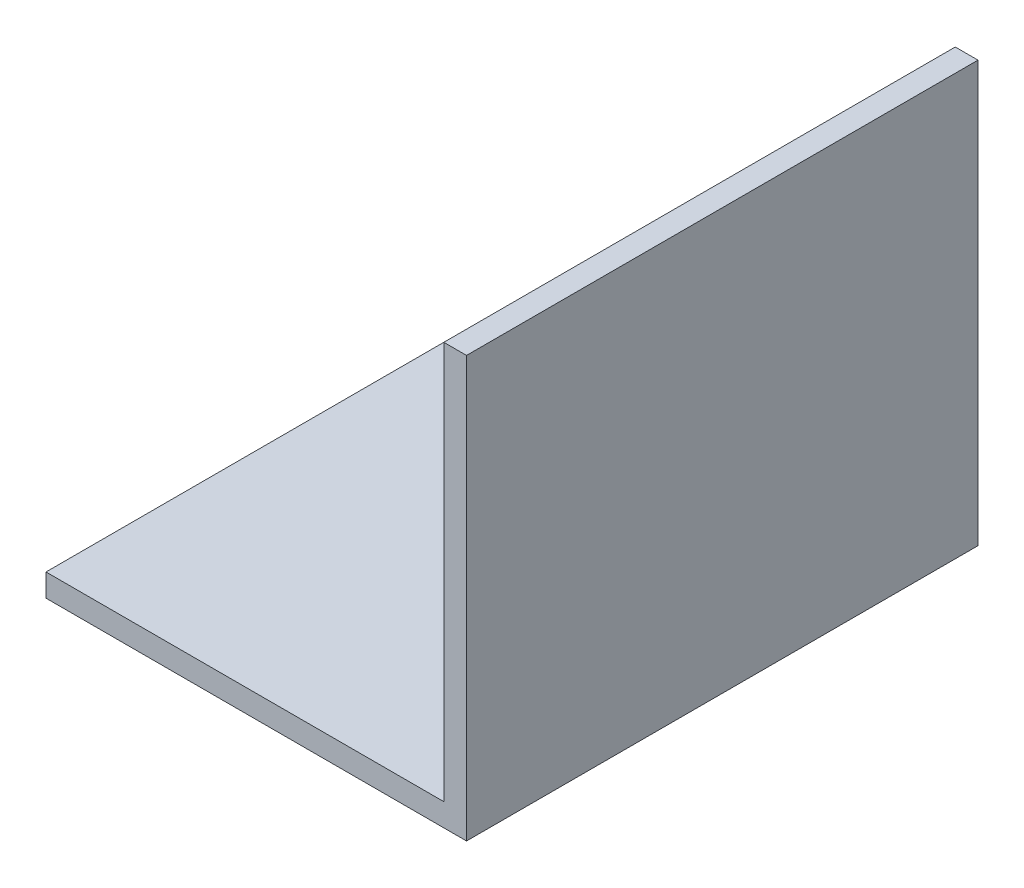
ISO-10303-21;
HEADER;
FILE_DESCRIPTION(('STEP AP214'),'2;1');
FILE_NAME('part.step','',(''),(''),'','','');
FILE_SCHEMA(('AUTOMOTIVE_DESIGN { 1 0 10303 214 1 1 1 1 }'));
ENDSEC;
DATA;
#1=APPLICATION_CONTEXT('core data for automotive mechanical design processes');
#2=APPLICATION_PROTOCOL_DEFINITION('international standard','automotive_design',2000,#1);
#3=PRODUCT_CONTEXT('',#1,'mechanical');
#4=PRODUCT('Part','Part','',(#3));
#5=PRODUCT_RELATED_PRODUCT_CATEGORY('part','',(#4));
#6=PRODUCT_DEFINITION_FORMATION('','',#4);
#7=PRODUCT_DEFINITION_CONTEXT('part definition',#1,'design');
#8=PRODUCT_DEFINITION('design','',#6,#7);
#9=PRODUCT_DEFINITION_SHAPE('','',#8);
#10=(LENGTH_UNIT() NAMED_UNIT(*) SI_UNIT(.MILLI.,.METRE.));
#11=(NAMED_UNIT(*) PLANE_ANGLE_UNIT() SI_UNIT($,.RADIAN.));
#12=(NAMED_UNIT(*) SI_UNIT($,.STERADIAN.) SOLID_ANGLE_UNIT());
#13=UNCERTAINTY_MEASURE_WITH_UNIT(LENGTH_MEASURE(1.E-05),#10,'distance_accuracy_value','');
#14=(GEOMETRIC_REPRESENTATION_CONTEXT(3) GLOBAL_UNCERTAINTY_ASSIGNED_CONTEXT((#13)) GLOBAL_UNIT_ASSIGNED_CONTEXT((#10,
#11,#12)) REPRESENTATION_CONTEXT('',''));
#15=CARTESIAN_POINT('',(0.,0.,0.));
#16=DIRECTION('',(0.,0.,1.));
#17=DIRECTION('',(1.,0.,0.));
#18=AXIS2_PLACEMENT_3D('',#15,#16,#17);
#19=CARTESIAN_POINT('',(-2.,37.,45.));
#20=DIRECTION('',(0.,-1.,0.));
#21=DIRECTION('',(0.,0.,-1.));
#22=AXIS2_PLACEMENT_3D('',#19,#20,#21);
#23=PLANE('',#22);
#24=DIRECTION('',(-1.,0.,0.));
#25=VECTOR('',#24,1.);
#26=CARTESIAN_POINT('',(-2.,37.,0.));
#27=LINE('',#26,#25);
#28=CARTESIAN_POINT('',(0.,37.,0.));
#29=VERTEX_POINT('',#28);
#30=CARTESIAN_POINT('',(-2.,37.,0.));
#31=VERTEX_POINT('',#30);
#32=EDGE_CURVE('E117',#29,#31,#27,.T.);
#33=ORIENTED_EDGE('',*,*,#32,.T.);
#34=DIRECTION('',(0.,0.,-1.));
#35=VECTOR('',#34,1.);
#36=CARTESIAN_POINT('',(-2.,37.,45.));
#37=LINE('',#36,#35);
#38=CARTESIAN_POINT('',(-2.,37.,45.));
#39=VERTEX_POINT('',#38);
#40=EDGE_CURVE('E11',#39,#31,#37,.T.);
#41=ORIENTED_EDGE('',*,*,#40,.F.);
#42=DIRECTION('',(-1.,0.,0.));
#43=VECTOR('',#42,1.);
#44=CARTESIAN_POINT('',(-2.,37.,45.));
#45=LINE('',#44,#43);
#46=CARTESIAN_POINT('',(0.,37.,45.));
#47=VERTEX_POINT('',#46);
#48=EDGE_CURVE('E127',#47,#39,#45,.T.);
#49=ORIENTED_EDGE('',*,*,#48,.F.);
#50=DIRECTION('',(0.,0.,-1.));
#51=VECTOR('',#50,1.);
#52=CARTESIAN_POINT('',(0.,37.,45.));
#53=LINE('',#52,#51);
#54=EDGE_CURVE('E113',#47,#29,#53,.T.);
#55=ORIENTED_EDGE('',*,*,#54,.T.);
#56=EDGE_LOOP('',(#33,#41,#49,#55));
#57=FACE_BOUND('',#56,.T.);
#58=ADVANCED_FACE('F33',(#57),#23,.F.);
#59=CARTESIAN_POINT('',(-2.,1.99999999999999,45.));
#60=DIRECTION('',(1.,0.,0.));
#61=DIRECTION('',(0.,0.,-1.));
#62=AXIS2_PLACEMENT_3D('',#59,#60,#61);
#63=PLANE('',#62);
#64=DIRECTION('',(0.,-1.,0.));
#65=VECTOR('',#64,1.);
#66=CARTESIAN_POINT('',(-2.,1.99999999999999,0.));
#67=LINE('',#66,#65);
#68=CARTESIAN_POINT('',(-2.,1.99999999999999,0.));
#69=VERTEX_POINT('',#68);
#70=EDGE_CURVE('E120',#31,#69,#67,.T.);
#71=ORIENTED_EDGE('',*,*,#70,.T.);
#72=DIRECTION('',(0.,0.,-1.));
#73=VECTOR('',#72,1.);
#74=CARTESIAN_POINT('',(-2.,1.99999999999999,45.));
#75=LINE('',#74,#73);
#76=CARTESIAN_POINT('',(-2.,1.99999999999999,45.));
#77=VERTEX_POINT('',#76);
#78=EDGE_CURVE('E41',#77,#69,#75,.T.);
#79=ORIENTED_EDGE('',*,*,#78,.F.);
#80=DIRECTION('',(0.,-1.,0.));
#81=VECTOR('',#80,1.);
#82=CARTESIAN_POINT('',(-2.,1.99999999999999,45.));
#83=LINE('',#82,#81);
#84=EDGE_CURVE('E86',#39,#77,#83,.T.);
#85=ORIENTED_EDGE('',*,*,#84,.F.);
#86=ORIENTED_EDGE('',*,*,#40,.T.);
#87=EDGE_LOOP('',(#71,#79,#85,#86));
#88=FACE_BOUND('',#87,.T.);
#89=ADVANCED_FACE('F151',(#88),#63,.F.);
#90=CARTESIAN_POINT('',(-37.,2.,45.));
#91=DIRECTION('',(0.,-1.,0.));
#92=DIRECTION('',(1.,0.,0.));
#93=AXIS2_PLACEMENT_3D('',#90,#91,#92);
#94=PLANE('',#93);
#95=DIRECTION('',(-1.,0.,0.));
#96=VECTOR('',#95,1.);
#97=CARTESIAN_POINT('',(-37.,2.,0.));
#98=LINE('',#97,#96);
#99=CARTESIAN_POINT('',(-37.,2.,0.));
#100=VERTEX_POINT('',#99);
#101=EDGE_CURVE('E122',#69,#100,#98,.T.);
#102=ORIENTED_EDGE('',*,*,#101,.T.);
#103=DIRECTION('',(0.,0.,-1.));
#104=VECTOR('',#103,1.);
#105=CARTESIAN_POINT('',(-37.,2.,45.));
#106=LINE('',#105,#104);
#107=CARTESIAN_POINT('',(-37.,2.,45.));
#108=VERTEX_POINT('',#107);
#109=EDGE_CURVE('E108',#108,#100,#106,.T.);
#110=ORIENTED_EDGE('',*,*,#109,.F.);
#111=DIRECTION('',(-1.,0.,0.));
#112=VECTOR('',#111,1.);
#113=CARTESIAN_POINT('',(-37.,2.,45.));
#114=LINE('',#113,#112);
#115=EDGE_CURVE('E99',#77,#108,#114,.T.);
#116=ORIENTED_EDGE('',*,*,#115,.F.);
#117=ORIENTED_EDGE('',*,*,#78,.T.);
#118=EDGE_LOOP('',(#102,#110,#116,#117));
#119=FACE_BOUND('',#118,.T.);
#120=ADVANCED_FACE('F133',(#119),#94,.F.);
#121=CARTESIAN_POINT('',(-37.,0.,45.));
#122=DIRECTION('',(1.,0.,0.));
#123=DIRECTION('',(0.,0.,-1.));
#124=AXIS2_PLACEMENT_3D('',#121,#122,#123);
#125=PLANE('',#124);
#126=DIRECTION('',(0.,-1.,0.));
#127=VECTOR('',#126,1.);
#128=CARTESIAN_POINT('',(-37.,0.,0.));
#129=LINE('',#128,#127);
#130=CARTESIAN_POINT('',(-37.,0.,0.));
#131=VERTEX_POINT('',#130);
#132=EDGE_CURVE('E107',#100,#131,#129,.T.);
#133=ORIENTED_EDGE('',*,*,#132,.T.);
#134=DIRECTION('',(0.,0.,-1.));
#135=VECTOR('',#134,1.);
#136=CARTESIAN_POINT('',(-37.,0.,45.));
#137=LINE('',#136,#135);
#138=CARTESIAN_POINT('',(-37.,0.,45.));
#139=VERTEX_POINT('',#138);
#140=EDGE_CURVE('E104',#139,#131,#137,.T.);
#141=ORIENTED_EDGE('',*,*,#140,.F.);
#142=DIRECTION('',(0.,-1.,0.));
#143=VECTOR('',#142,1.);
#144=CARTESIAN_POINT('',(-37.,0.,45.));
#145=LINE('',#144,#143);
#146=EDGE_CURVE('E93',#108,#139,#145,.T.);
#147=ORIENTED_EDGE('',*,*,#146,.F.);
#148=ORIENTED_EDGE('',*,*,#109,.T.);
#149=EDGE_LOOP('',(#133,#141,#147,#148));
#150=FACE_BOUND('',#149,.T.);
#151=ADVANCED_FACE('F105',(#150),#125,.F.);
#152=CARTESIAN_POINT('',(0.,0.,45.));
#153=DIRECTION('',(0.,1.,0.));
#154=DIRECTION('',(-1.,0.,0.));
#155=AXIS2_PLACEMENT_3D('',#152,#153,#154);
#156=PLANE('',#155);
#157=DIRECTION('',(1.,0.,0.));
#158=VECTOR('',#157,1.);
#159=CARTESIAN_POINT('',(0.,0.,0.));
#160=LINE('',#159,#158);
#161=CARTESIAN_POINT('',(0.,0.,0.));
#162=VERTEX_POINT('',#161);
#163=EDGE_CURVE('E72',#131,#162,#160,.T.);
#164=ORIENTED_EDGE('',*,*,#163,.T.);
#165=DIRECTION('',(0.,0.,-1.));
#166=VECTOR('',#165,1.);
#167=CARTESIAN_POINT('',(0.,0.,45.));
#168=LINE('',#167,#166);
#169=CARTESIAN_POINT('',(0.,0.,45.));
#170=VERTEX_POINT('',#169);
#171=EDGE_CURVE('E109',#170,#162,#168,.T.);
#172=ORIENTED_EDGE('',*,*,#171,.F.);
#173=DIRECTION('',(1.,0.,0.));
#174=VECTOR('',#173,1.);
#175=CARTESIAN_POINT('',(0.,0.,45.));
#176=LINE('',#175,#174);
#177=EDGE_CURVE('E97',#139,#170,#176,.T.);
#178=ORIENTED_EDGE('',*,*,#177,.F.);
#179=ORIENTED_EDGE('',*,*,#140,.T.);
#180=EDGE_LOOP('',(#164,#172,#178,#179));
#181=FACE_BOUND('',#180,.T.);
#182=ADVANCED_FACE('F111',(#181),#156,.F.);
#183=CARTESIAN_POINT('',(0.,37.,45.));
#184=DIRECTION('',(-1.,0.,0.));
#185=DIRECTION('',(0.,-1.,0.));
#186=AXIS2_PLACEMENT_3D('',#183,#184,#185);
#187=PLANE('',#186);
#188=DIRECTION('',(0.,1.,0.));
#189=VECTOR('',#188,1.);
#190=CARTESIAN_POINT('',(0.,37.,0.));
#191=LINE('',#190,#189);
#192=EDGE_CURVE('E78',#162,#29,#191,.T.);
#193=ORIENTED_EDGE('',*,*,#192,.T.);
#194=ORIENTED_EDGE('',*,*,#54,.F.);
#195=DIRECTION('',(0.,1.,0.));
#196=VECTOR('',#195,1.);
#197=CARTESIAN_POINT('',(0.,37.,45.));
#198=LINE('',#197,#196);
#199=EDGE_CURVE('E49',#170,#47,#198,.T.);
#200=ORIENTED_EDGE('',*,*,#199,.F.);
#201=ORIENTED_EDGE('',*,*,#171,.T.);
#202=EDGE_LOOP('',(#193,#194,#200,#201));
#203=FACE_BOUND('',#202,.T.);
#204=ADVANCED_FACE('F140',(#203),#187,.F.);
#205=CARTESIAN_POINT('',(0.,0.,45.));
#206=DIRECTION('',(0.,0.,-1.));
#207=DIRECTION('',(-1.,0.,0.));
#208=AXIS2_PLACEMENT_3D('',#205,#206,#207);
#209=PLANE('',#208);
#210=ORIENTED_EDGE('',*,*,#48,.T.);
#211=ORIENTED_EDGE('',*,*,#84,.T.);
#212=ORIENTED_EDGE('',*,*,#115,.T.);
#213=ORIENTED_EDGE('',*,*,#146,.T.);
#214=ORIENTED_EDGE('',*,*,#177,.T.);
#215=ORIENTED_EDGE('',*,*,#199,.T.);
#216=EDGE_LOOP('',(#210,#211,#212,#213,#214,#215));
#217=FACE_BOUND('',#216,.T.);
#218=ADVANCED_FACE('F95',(#217),#209,.F.);
#219=CARTESIAN_POINT('',(0.,0.,0.));
#220=DIRECTION('',(0.,0.,-1.));
#221=DIRECTION('',(-1.,0.,0.));
#222=AXIS2_PLACEMENT_3D('',#219,#220,#221);
#223=PLANE('',#222);
#224=ORIENTED_EDGE('',*,*,#32,.F.);
#225=ORIENTED_EDGE('',*,*,#192,.F.);
#226=ORIENTED_EDGE('',*,*,#163,.F.);
#227=ORIENTED_EDGE('',*,*,#132,.F.);
#228=ORIENTED_EDGE('',*,*,#101,.F.);
#229=ORIENTED_EDGE('',*,*,#70,.F.);
#230=EDGE_LOOP('',(#224,#225,#226,#227,#228,#229));
#231=FACE_BOUND('',#230,.T.);
#232=ADVANCED_FACE('F136',(#231),#223,.T.);
#233=CLOSED_SHELL('',(#58,#89,#120,#151,#182,#204,#218,#232));
#234=MANIFOLD_SOLID_BREP('B2',#233);
#235=ADVANCED_BREP_SHAPE_REPRESENTATION('',(#18,#234),#14);
#236=SHAPE_DEFINITION_REPRESENTATION(#9,#235);
ENDSEC;
END-ISO-10303-21;
